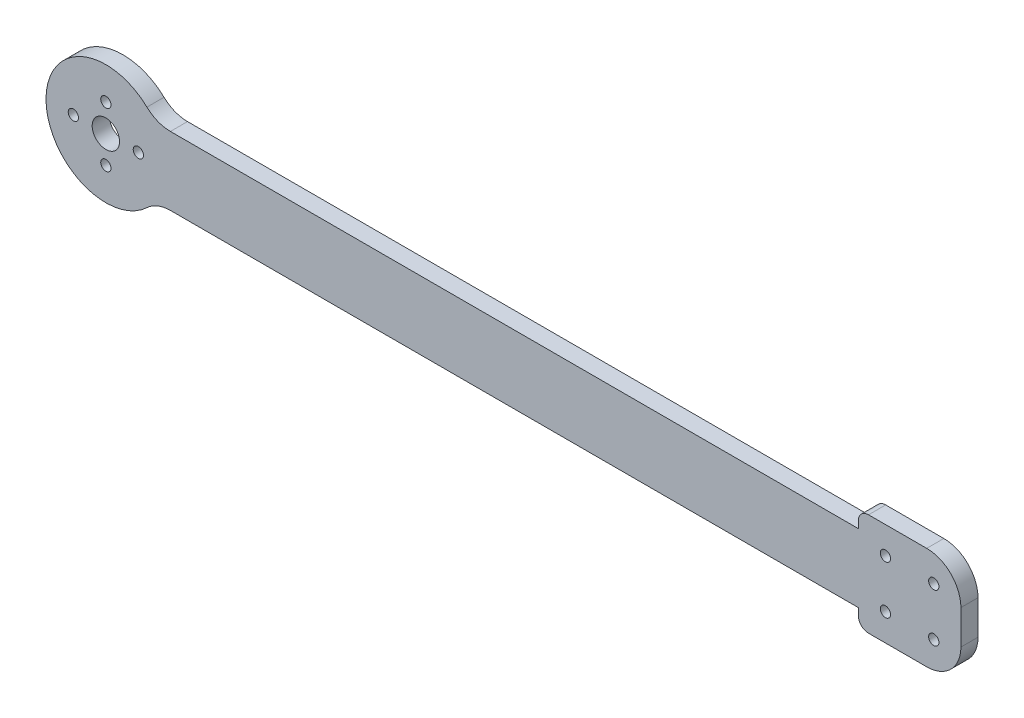
ISO-10303-21;
HEADER;
FILE_DESCRIPTION(('STEP AP214'),'2;1');
FILE_NAME('part.step','',(''),(''),'','','');
FILE_SCHEMA(('AUTOMOTIVE_DESIGN { 1 0 10303 214 1 1 1 1 }'));
ENDSEC;
DATA;
#1=APPLICATION_CONTEXT('core data for automotive mechanical design processes');
#2=APPLICATION_PROTOCOL_DEFINITION('international standard','automotive_design',2000,#1);
#3=PRODUCT_CONTEXT('',#1,'mechanical');
#4=PRODUCT('Part','Part','',(#3));
#5=PRODUCT_RELATED_PRODUCT_CATEGORY('part','',(#4));
#6=PRODUCT_DEFINITION_FORMATION('','',#4);
#7=PRODUCT_DEFINITION_CONTEXT('part definition',#1,'design');
#8=PRODUCT_DEFINITION('design','',#6,#7);
#9=PRODUCT_DEFINITION_SHAPE('','',#8);
#10=(LENGTH_UNIT() NAMED_UNIT(*) SI_UNIT(.MILLI.,.METRE.));
#11=(NAMED_UNIT(*) PLANE_ANGLE_UNIT() SI_UNIT($,.RADIAN.));
#12=(NAMED_UNIT(*) SI_UNIT($,.STERADIAN.) SOLID_ANGLE_UNIT());
#13=UNCERTAINTY_MEASURE_WITH_UNIT(LENGTH_MEASURE(1.E-05),#10,'distance_accuracy_value','');
#14=(GEOMETRIC_REPRESENTATION_CONTEXT(3) GLOBAL_UNCERTAINTY_ASSIGNED_CONTEXT((#13)) GLOBAL_UNIT_ASSIGNED_CONTEXT((#10,
#11,#12)) REPRESENTATION_CONTEXT('',''));
#15=CARTESIAN_POINT('',(0.,0.,0.));
#16=DIRECTION('',(0.,0.,1.));
#17=DIRECTION('',(1.,0.,0.));
#18=AXIS2_PLACEMENT_3D('',#15,#16,#17);
#19=CARTESIAN_POINT('',(240.,5.,5.));
#20=DIRECTION('',(0.,0.,-1.));
#21=DIRECTION('',(-1.,0.,0.));
#22=AXIS2_PLACEMENT_3D('',#19,#20,#21);
#23=PLANE('',#22);
#24=CARTESIAN_POINT('',(240.,5.,5.));
#25=DIRECTION('',(0.,0.,1.));
#26=DIRECTION('',(-1.,0.,0.));
#27=AXIS2_PLACEMENT_3D('',#24,#25,#26);
#28=CIRCLE('',#27,10.);
#29=CARTESIAN_POINT('',(250.,4.99999999999993,5.));
#30=VERTEX_POINT('',#29);
#31=CARTESIAN_POINT('',(240.,15.,5.));
#32=VERTEX_POINT('',#31);
#33=EDGE_CURVE('E195',#30,#32,#28,.T.);
#34=ORIENTED_EDGE('',*,*,#33,.T.);
#35=DIRECTION('',(-1.,0.,0.));
#36=VECTOR('',#35,1.);
#37=CARTESIAN_POINT('',(240.,15.,5.));
#38=LINE('',#37,#36);
#39=CARTESIAN_POINT('',(223.,15.,5.));
#40=VERTEX_POINT('',#39);
#41=EDGE_CURVE('E113',#32,#40,#38,.T.);
#42=ORIENTED_EDGE('',*,*,#41,.T.);
#43=CARTESIAN_POINT('',(223.,12.,5.));
#44=DIRECTION('',(0.,0.,1.));
#45=DIRECTION('',(-1.,0.,0.));
#46=AXIS2_PLACEMENT_3D('',#43,#44,#45);
#47=CIRCLE('',#46,3.);
#48=CARTESIAN_POINT('',(220.,12.,5.));
#49=VERTEX_POINT('',#48);
#50=EDGE_CURVE('E228',#40,#49,#47,.T.);
#51=ORIENTED_EDGE('',*,*,#50,.T.);
#52=DIRECTION('',(0.,-1.,0.));
#53=VECTOR('',#52,1.);
#54=CARTESIAN_POINT('',(220.,12.,5.));
#55=LINE('',#54,#53);
#56=CARTESIAN_POINT('',(220.,10.,5.));
#57=VERTEX_POINT('',#56);
#58=EDGE_CURVE('E247',#49,#57,#55,.T.);
#59=ORIENTED_EDGE('',*,*,#58,.T.);
#60=DIRECTION('',(-1.,0.,0.));
#61=VECTOR('',#60,1.);
#62=CARTESIAN_POINT('',(18.8745860881769,10.,5.));
#63=LINE('',#62,#61);
#64=CARTESIAN_POINT('',(18.8745860881769,10.,5.));
#65=VERTEX_POINT('',#64);
#66=EDGE_CURVE('E244',#57,#65,#63,.T.);
#67=ORIENTED_EDGE('',*,*,#66,.T.);
#68=CARTESIAN_POINT('',(18.8745860881769,20.,5.));
#69=DIRECTION('',(0.,0.,-1.));
#70=DIRECTION('',(-1.,0.,0.));
#71=AXIS2_PLACEMENT_3D('',#68,#69,#70);
#72=CIRCLE('',#71,10.);
#73=CARTESIAN_POINT('',(12.0111002379307,12.7272727272727,5.));
#74=VERTEX_POINT('',#73);
#75=EDGE_CURVE('E246',#65,#74,#72,.T.);
#76=ORIENTED_EDGE('',*,*,#75,.T.);
#77=CARTESIAN_POINT('',(0.,0.,5.));
#78=DIRECTION('',(0.,0.,1.));
#79=DIRECTION('',(1.,0.,0.));
#80=AXIS2_PLACEMENT_3D('',#77,#78,#79);
#81=CIRCLE('',#80,17.5);
#82=CARTESIAN_POINT('',(12.0111002379307,-12.7272727272727,5.));
#83=VERTEX_POINT('',#82);
#84=EDGE_CURVE('E249',#74,#83,#81,.T.);
#85=ORIENTED_EDGE('',*,*,#84,.T.);
#86=CARTESIAN_POINT('',(18.8745860881769,-20.,5.));
#87=DIRECTION('',(0.,0.,-1.));
#88=DIRECTION('',(-1.,0.,0.));
#89=AXIS2_PLACEMENT_3D('',#86,#87,#88);
#90=CIRCLE('',#89,10.);
#91=CARTESIAN_POINT('',(18.8745860881769,-10.,5.));
#92=VERTEX_POINT('',#91);
#93=EDGE_CURVE('E255',#83,#92,#90,.T.);
#94=ORIENTED_EDGE('',*,*,#93,.T.);
#95=DIRECTION('',(1.,0.,0.));
#96=VECTOR('',#95,1.);
#97=CARTESIAN_POINT('',(18.8745860881769,-10.,5.));
#98=LINE('',#97,#96);
#99=CARTESIAN_POINT('',(220.,-10.,5.));
#100=VERTEX_POINT('',#99);
#101=EDGE_CURVE('E257',#92,#100,#98,.T.);
#102=ORIENTED_EDGE('',*,*,#101,.T.);
#103=DIRECTION('',(0.,-1.,0.));
#104=VECTOR('',#103,1.);
#105=CARTESIAN_POINT('',(220.,-10.,5.));
#106=LINE('',#105,#104);
#107=CARTESIAN_POINT('',(220.,-12.,5.));
#108=VERTEX_POINT('',#107);
#109=EDGE_CURVE('E259',#100,#108,#106,.T.);
#110=ORIENTED_EDGE('',*,*,#109,.T.);
#111=CARTESIAN_POINT('',(223.,-12.,5.));
#112=DIRECTION('',(0.,0.,1.));
#113=DIRECTION('',(-1.,0.,0.));
#114=AXIS2_PLACEMENT_3D('',#111,#112,#113);
#115=CIRCLE('',#114,3.);
#116=CARTESIAN_POINT('',(223.,-15.,5.));
#117=VERTEX_POINT('',#116);
#118=EDGE_CURVE('E150',#108,#117,#115,.T.);
#119=ORIENTED_EDGE('',*,*,#118,.T.);
#120=DIRECTION('',(1.,0.,0.));
#121=VECTOR('',#120,1.);
#122=CARTESIAN_POINT('',(240.,-15.,5.));
#123=LINE('',#122,#121);
#124=CARTESIAN_POINT('',(240.,-15.,5.));
#125=VERTEX_POINT('',#124);
#126=EDGE_CURVE('E144',#117,#125,#123,.T.);
#127=ORIENTED_EDGE('',*,*,#126,.T.);
#128=CARTESIAN_POINT('',(240.,-5.,5.));
#129=DIRECTION('',(0.,0.,1.));
#130=DIRECTION('',(-1.,0.,0.));
#131=AXIS2_PLACEMENT_3D('',#128,#129,#130);
#132=CIRCLE('',#131,10.);
#133=CARTESIAN_POINT('',(250.,-4.99999999999993,5.));
#134=VERTEX_POINT('',#133);
#135=EDGE_CURVE('E148',#125,#134,#132,.T.);
#136=ORIENTED_EDGE('',*,*,#135,.T.);
#137=DIRECTION('',(0.,1.,0.));
#138=VECTOR('',#137,1.);
#139=CARTESIAN_POINT('',(250.,-4.99999999999993,5.));
#140=LINE('',#139,#138);
#141=EDGE_CURVE('E52',#134,#30,#140,.T.);
#142=ORIENTED_EDGE('',*,*,#141,.T.);
#143=EDGE_LOOP('',(#34,#42,#51,#59,#67,#76,#85,#94,#102,#110,#119,#127,#136,#142));
#144=FACE_BOUND('',#143,.T.);
#145=CARTESIAN_POINT('',(0.,0.,5.));
#146=DIRECTION('',(0.,0.,1.));
#147=DIRECTION('',(1.,0.,0.));
#148=AXIS2_PLACEMENT_3D('',#145,#146,#147);
#149=CIRCLE('',#148,4.);
#150=CARTESIAN_POINT('',(4.,0.,5.));
#151=VERTEX_POINT('',#150);
#152=EDGE_CURVE('E172',#151,#151,#149,.T.);
#153=ORIENTED_EDGE('',*,*,#152,.F.);
#154=EDGE_LOOP('',(#153));
#155=FACE_BOUND('',#154,.T.);
#156=CARTESIAN_POINT('',(9.5,0.,5.));
#157=DIRECTION('',(0.,0.,1.));
#158=DIRECTION('',(1.,0.,0.));
#159=AXIS2_PLACEMENT_3D('',#156,#157,#158);
#160=CIRCLE('',#159,1.50000000000003);
#161=CARTESIAN_POINT('',(11.,0.,5.));
#162=VERTEX_POINT('',#161);
#163=EDGE_CURVE('E373',#162,#162,#160,.T.);
#164=ORIENTED_EDGE('',*,*,#163,.F.);
#165=EDGE_LOOP('',(#164));
#166=FACE_BOUND('',#165,.T.);
#167=CARTESIAN_POINT('',(0.,8.,5.));
#168=DIRECTION('',(0.,0.,1.));
#169=DIRECTION('',(1.,0.,0.));
#170=AXIS2_PLACEMENT_3D('',#167,#168,#169);
#171=CIRCLE('',#170,1.5);
#172=CARTESIAN_POINT('',(1.5,8.,5.));
#173=VERTEX_POINT('',#172);
#174=EDGE_CURVE('E367',#173,#173,#171,.T.);
#175=ORIENTED_EDGE('',*,*,#174,.F.);
#176=EDGE_LOOP('',(#175));
#177=FACE_BOUND('',#176,.T.);
#178=CARTESIAN_POINT('',(-9.5,0.,5.));
#179=DIRECTION('',(0.,0.,1.));
#180=DIRECTION('',(1.,0.,0.));
#181=AXIS2_PLACEMENT_3D('',#178,#179,#180);
#182=CIRCLE('',#181,1.50000000000009);
#183=CARTESIAN_POINT('',(-7.99999999999991,0.,5.));
#184=VERTEX_POINT('',#183);
#185=EDGE_CURVE('E361',#184,#184,#182,.T.);
#186=ORIENTED_EDGE('',*,*,#185,.F.);
#187=EDGE_LOOP('',(#186));
#188=FACE_BOUND('',#187,.T.);
#189=CARTESIAN_POINT('',(0.,-8.,5.));
#190=DIRECTION('',(0.,0.,1.));
#191=DIRECTION('',(1.,0.,0.));
#192=AXIS2_PLACEMENT_3D('',#189,#190,#191);
#193=CIRCLE('',#192,1.5);
#194=CARTESIAN_POINT('',(1.5,-8.,5.));
#195=VERTEX_POINT('',#194);
#196=EDGE_CURVE('E355',#195,#195,#193,.T.);
#197=ORIENTED_EDGE('',*,*,#196,.F.);
#198=EDGE_LOOP('',(#197));
#199=FACE_BOUND('',#198,.T.);
#200=CARTESIAN_POINT('',(227.928932188134,7.07106781186549,5.));
#201=DIRECTION('',(0.,0.,1.));
#202=DIRECTION('',(1.,0.,0.));
#203=AXIS2_PLACEMENT_3D('',#200,#201,#202);
#204=CIRCLE('',#203,1.5);
#205=CARTESIAN_POINT('',(229.428932188134,7.07106781186549,5.));
#206=VERTEX_POINT('',#205);
#207=EDGE_CURVE('E349',#206,#206,#204,.T.);
#208=ORIENTED_EDGE('',*,*,#207,.F.);
#209=EDGE_LOOP('',(#208));
#210=FACE_BOUND('',#209,.T.);
#211=CARTESIAN_POINT('',(242.071067811866,-7.07106781186549,5.));
#212=DIRECTION('',(0.,0.,1.));
#213=DIRECTION('',(-1.,0.,0.));
#214=AXIS2_PLACEMENT_3D('',#211,#212,#213);
#215=CIRCLE('',#214,1.49999999999999);
#216=CARTESIAN_POINT('',(240.571067811866,-7.07106781186549,5.));
#217=VERTEX_POINT('',#216);
#218=EDGE_CURVE('E343',#217,#217,#215,.T.);
#219=ORIENTED_EDGE('',*,*,#218,.F.);
#220=EDGE_LOOP('',(#219));
#221=FACE_BOUND('',#220,.T.);
#222=CARTESIAN_POINT('',(242.071067811866,7.07106781186549,5.));
#223=DIRECTION('',(0.,0.,1.));
#224=DIRECTION('',(1.,0.,0.));
#225=AXIS2_PLACEMENT_3D('',#222,#223,#224);
#226=CIRCLE('',#225,1.49999999999999);
#227=CARTESIAN_POINT('',(243.571067811866,7.07106781186549,5.));
#228=VERTEX_POINT('',#227);
#229=EDGE_CURVE('E337',#228,#228,#226,.T.);
#230=ORIENTED_EDGE('',*,*,#229,.F.);
#231=EDGE_LOOP('',(#230));
#232=FACE_BOUND('',#231,.T.);
#233=CARTESIAN_POINT('',(227.928932188134,-7.07106781186549,5.));
#234=DIRECTION('',(0.,0.,1.));
#235=DIRECTION('',(-1.,0.,0.));
#236=AXIS2_PLACEMENT_3D('',#233,#234,#235);
#237=CIRCLE('',#236,1.5);
#238=CARTESIAN_POINT('',(226.428932188134,-7.07106781186549,5.));
#239=VERTEX_POINT('',#238);
#240=EDGE_CURVE('E328',#239,#239,#237,.T.);
#241=ORIENTED_EDGE('',*,*,#240,.F.);
#242=EDGE_LOOP('',(#241));
#243=FACE_BOUND('',#242,.T.);
#244=ADVANCED_FACE('F35',(#144,#155,#166,#177,#188,#199,#210,#221,#232,#243),#23,.F.);
#245=CARTESIAN_POINT('',(240.,5.,0.));
#246=DIRECTION('',(0.,0.,-1.));
#247=DIRECTION('',(-1.,0.,0.));
#248=AXIS2_PLACEMENT_3D('',#245,#246,#247);
#249=PLANE('',#248);
#250=CARTESIAN_POINT('',(242.071067811866,7.07106781186549,0.));
#251=DIRECTION('',(0.,0.,1.));
#252=DIRECTION('',(1.,0.,0.));
#253=AXIS2_PLACEMENT_3D('',#250,#251,#252);
#254=CIRCLE('',#253,1.49999999999999);
#255=CARTESIAN_POINT('',(243.571067811866,7.07106781186549,0.));
#256=VERTEX_POINT('',#255);
#257=EDGE_CURVE('E334',#256,#256,#254,.T.);
#258=ORIENTED_EDGE('',*,*,#257,.T.);
#259=EDGE_LOOP('',(#258));
#260=FACE_BOUND('',#259,.T.);
#261=CARTESIAN_POINT('',(227.928932188134,7.07106781186549,0.));
#262=DIRECTION('',(0.,0.,1.));
#263=DIRECTION('',(1.,0.,0.));
#264=AXIS2_PLACEMENT_3D('',#261,#262,#263);
#265=CIRCLE('',#264,1.5);
#266=CARTESIAN_POINT('',(229.428932188134,7.07106781186549,0.));
#267=VERTEX_POINT('',#266);
#268=EDGE_CURVE('E346',#267,#267,#265,.T.);
#269=ORIENTED_EDGE('',*,*,#268,.T.);
#270=EDGE_LOOP('',(#269));
#271=FACE_BOUND('',#270,.T.);
#272=CARTESIAN_POINT('',(-9.5,0.,0.));
#273=DIRECTION('',(0.,0.,1.));
#274=DIRECTION('',(1.,0.,0.));
#275=AXIS2_PLACEMENT_3D('',#272,#273,#274);
#276=CIRCLE('',#275,1.50000000000009);
#277=CARTESIAN_POINT('',(-7.99999999999991,0.,0.));
#278=VERTEX_POINT('',#277);
#279=EDGE_CURVE('E358',#278,#278,#276,.T.);
#280=ORIENTED_EDGE('',*,*,#279,.T.);
#281=EDGE_LOOP('',(#280));
#282=FACE_BOUND('',#281,.T.);
#283=CARTESIAN_POINT('',(9.5,0.,0.));
#284=DIRECTION('',(0.,0.,1.));
#285=DIRECTION('',(1.,0.,0.));
#286=AXIS2_PLACEMENT_3D('',#283,#284,#285);
#287=CIRCLE('',#286,1.50000000000003);
#288=CARTESIAN_POINT('',(11.,0.,0.));
#289=VERTEX_POINT('',#288);
#290=EDGE_CURVE('E370',#289,#289,#287,.T.);
#291=ORIENTED_EDGE('',*,*,#290,.T.);
#292=EDGE_LOOP('',(#291));
#293=FACE_BOUND('',#292,.T.);
#294=CARTESIAN_POINT('',(240.,5.,0.));
#295=DIRECTION('',(0.,0.,1.));
#296=DIRECTION('',(-1.,0.,0.));
#297=AXIS2_PLACEMENT_3D('',#294,#295,#296);
#298=CIRCLE('',#297,10.);
#299=CARTESIAN_POINT('',(250.,4.99999999999993,0.));
#300=VERTEX_POINT('',#299);
#301=CARTESIAN_POINT('',(240.,15.,0.));
#302=VERTEX_POINT('',#301);
#303=EDGE_CURVE('E168',#300,#302,#298,.T.);
#304=ORIENTED_EDGE('',*,*,#303,.F.);
#305=DIRECTION('',(0.,1.,0.));
#306=VECTOR('',#305,1.);
#307=CARTESIAN_POINT('',(250.,-4.99999999999993,0.));
#308=LINE('',#307,#306);
#309=CARTESIAN_POINT('',(250.,-4.99999999999993,0.));
#310=VERTEX_POINT('',#309);
#311=EDGE_CURVE('E105',#310,#300,#308,.T.);
#312=ORIENTED_EDGE('',*,*,#311,.F.);
#313=CARTESIAN_POINT('',(240.,-5.,0.));
#314=DIRECTION('',(0.,0.,1.));
#315=DIRECTION('',(-1.,0.,0.));
#316=AXIS2_PLACEMENT_3D('',#313,#314,#315);
#317=CIRCLE('',#316,10.);
#318=CARTESIAN_POINT('',(240.,-15.,0.));
#319=VERTEX_POINT('',#318);
#320=EDGE_CURVE('E99',#319,#310,#317,.T.);
#321=ORIENTED_EDGE('',*,*,#320,.F.);
#322=DIRECTION('',(1.,0.,0.));
#323=VECTOR('',#322,1.);
#324=CARTESIAN_POINT('',(240.,-15.,0.));
#325=LINE('',#324,#323);
#326=CARTESIAN_POINT('',(223.,-15.,0.));
#327=VERTEX_POINT('',#326);
#328=EDGE_CURVE('E158',#327,#319,#325,.T.);
#329=ORIENTED_EDGE('',*,*,#328,.F.);
#330=CARTESIAN_POINT('',(223.,-12.,0.));
#331=DIRECTION('',(0.,0.,1.));
#332=DIRECTION('',(-1.,0.,0.));
#333=AXIS2_PLACEMENT_3D('',#330,#331,#332);
#334=CIRCLE('',#333,3.);
#335=CARTESIAN_POINT('',(220.,-12.,0.));
#336=VERTEX_POINT('',#335);
#337=EDGE_CURVE('E190',#336,#327,#334,.T.);
#338=ORIENTED_EDGE('',*,*,#337,.F.);
#339=DIRECTION('',(0.,-1.,0.));
#340=VECTOR('',#339,1.);
#341=CARTESIAN_POINT('',(220.,-10.,0.));
#342=LINE('',#341,#340);
#343=CARTESIAN_POINT('',(220.,-10.,0.));
#344=VERTEX_POINT('',#343);
#345=EDGE_CURVE('E188',#344,#336,#342,.T.);
#346=ORIENTED_EDGE('',*,*,#345,.F.);
#347=DIRECTION('',(1.,0.,0.));
#348=VECTOR('',#347,1.);
#349=CARTESIAN_POINT('',(18.8745860881769,-10.,0.));
#350=LINE('',#349,#348);
#351=CARTESIAN_POINT('',(18.8745860881769,-10.,0.));
#352=VERTEX_POINT('',#351);
#353=EDGE_CURVE('E186',#352,#344,#350,.T.);
#354=ORIENTED_EDGE('',*,*,#353,.F.);
#355=CARTESIAN_POINT('',(18.8745860881769,-20.,0.));
#356=DIRECTION('',(0.,0.,-1.));
#357=DIRECTION('',(-1.,0.,0.));
#358=AXIS2_PLACEMENT_3D('',#355,#356,#357);
#359=CIRCLE('',#358,10.);
#360=CARTESIAN_POINT('',(12.0111002379307,-12.7272727272727,0.));
#361=VERTEX_POINT('',#360);
#362=EDGE_CURVE('E184',#361,#352,#359,.T.);
#363=ORIENTED_EDGE('',*,*,#362,.F.);
#364=CARTESIAN_POINT('',(0.,0.,0.));
#365=DIRECTION('',(0.,0.,1.));
#366=DIRECTION('',(1.,0.,0.));
#367=AXIS2_PLACEMENT_3D('',#364,#365,#366);
#368=CIRCLE('',#367,17.5);
#369=CARTESIAN_POINT('',(12.0111002379307,12.7272727272727,0.));
#370=VERTEX_POINT('',#369);
#371=EDGE_CURVE('E182',#370,#361,#368,.T.);
#372=ORIENTED_EDGE('',*,*,#371,.F.);
#373=CARTESIAN_POINT('',(18.8745860881769,20.,0.));
#374=DIRECTION('',(0.,0.,-1.));
#375=DIRECTION('',(-1.,0.,0.));
#376=AXIS2_PLACEMENT_3D('',#373,#374,#375);
#377=CIRCLE('',#376,10.);
#378=CARTESIAN_POINT('',(18.8745860881769,10.,0.));
#379=VERTEX_POINT('',#378);
#380=EDGE_CURVE('E180',#379,#370,#377,.T.);
#381=ORIENTED_EDGE('',*,*,#380,.F.);
#382=DIRECTION('',(-1.,0.,0.));
#383=VECTOR('',#382,1.);
#384=CARTESIAN_POINT('',(18.8745860881769,10.,0.));
#385=LINE('',#384,#383);
#386=CARTESIAN_POINT('',(220.,10.,0.));
#387=VERTEX_POINT('',#386);
#388=EDGE_CURVE('E178',#387,#379,#385,.T.);
#389=ORIENTED_EDGE('',*,*,#388,.F.);
#390=DIRECTION('',(0.,-1.,0.));
#391=VECTOR('',#390,1.);
#392=CARTESIAN_POINT('',(220.,12.,0.));
#393=LINE('',#392,#391);
#394=CARTESIAN_POINT('',(220.,12.,0.));
#395=VERTEX_POINT('',#394);
#396=EDGE_CURVE('E176',#395,#387,#393,.T.);
#397=ORIENTED_EDGE('',*,*,#396,.F.);
#398=CARTESIAN_POINT('',(223.,12.,0.));
#399=DIRECTION('',(0.,0.,1.));
#400=DIRECTION('',(-1.,0.,0.));
#401=AXIS2_PLACEMENT_3D('',#398,#399,#400);
#402=CIRCLE('',#401,3.);
#403=CARTESIAN_POINT('',(223.,15.,0.));
#404=VERTEX_POINT('',#403);
#405=EDGE_CURVE('E174',#404,#395,#402,.T.);
#406=ORIENTED_EDGE('',*,*,#405,.F.);
#407=DIRECTION('',(-1.,0.,0.));
#408=VECTOR('',#407,1.);
#409=CARTESIAN_POINT('',(240.,15.,0.));
#410=LINE('',#409,#408);
#411=EDGE_CURVE('E171',#302,#404,#410,.T.);
#412=ORIENTED_EDGE('',*,*,#411,.F.);
#413=EDGE_LOOP('',(#304,#312,#321,#329,#338,#346,#354,#363,#372,#381,#389,#397,#406,#412));
#414=FACE_BOUND('',#413,.T.);
#415=CARTESIAN_POINT('',(0.,0.,0.));
#416=DIRECTION('',(0.,0.,1.));
#417=DIRECTION('',(1.,0.,0.));
#418=AXIS2_PLACEMENT_3D('',#415,#416,#417);
#419=CIRCLE('',#418,4.);
#420=CARTESIAN_POINT('',(4.,0.,0.));
#421=VERTEX_POINT('',#420);
#422=EDGE_CURVE('E376',#421,#421,#419,.T.);
#423=ORIENTED_EDGE('',*,*,#422,.T.);
#424=EDGE_LOOP('',(#423));
#425=FACE_BOUND('',#424,.T.);
#426=CARTESIAN_POINT('',(0.,8.,0.));
#427=DIRECTION('',(0.,0.,1.));
#428=DIRECTION('',(1.,0.,0.));
#429=AXIS2_PLACEMENT_3D('',#426,#427,#428);
#430=CIRCLE('',#429,1.5);
#431=CARTESIAN_POINT('',(1.5,8.,0.));
#432=VERTEX_POINT('',#431);
#433=EDGE_CURVE('E364',#432,#432,#430,.T.);
#434=ORIENTED_EDGE('',*,*,#433,.T.);
#435=EDGE_LOOP('',(#434));
#436=FACE_BOUND('',#435,.T.);
#437=CARTESIAN_POINT('',(0.,-8.,0.));
#438=DIRECTION('',(0.,0.,1.));
#439=DIRECTION('',(1.,0.,0.));
#440=AXIS2_PLACEMENT_3D('',#437,#438,#439);
#441=CIRCLE('',#440,1.5);
#442=CARTESIAN_POINT('',(1.5,-8.,0.));
#443=VERTEX_POINT('',#442);
#444=EDGE_CURVE('E352',#443,#443,#441,.T.);
#445=ORIENTED_EDGE('',*,*,#444,.T.);
#446=EDGE_LOOP('',(#445));
#447=FACE_BOUND('',#446,.T.);
#448=CARTESIAN_POINT('',(242.071067811866,-7.07106781186549,0.));
#449=DIRECTION('',(0.,0.,1.));
#450=DIRECTION('',(-1.,0.,0.));
#451=AXIS2_PLACEMENT_3D('',#448,#449,#450);
#452=CIRCLE('',#451,1.49999999999999);
#453=CARTESIAN_POINT('',(240.571067811866,-7.07106781186549,0.));
#454=VERTEX_POINT('',#453);
#455=EDGE_CURVE('E340',#454,#454,#452,.T.);
#456=ORIENTED_EDGE('',*,*,#455,.T.);
#457=EDGE_LOOP('',(#456));
#458=FACE_BOUND('',#457,.T.);
#459=CARTESIAN_POINT('',(227.928932188134,-7.07106781186549,0.));
#460=DIRECTION('',(0.,0.,1.));
#461=DIRECTION('',(-1.,0.,0.));
#462=AXIS2_PLACEMENT_3D('',#459,#460,#461);
#463=CIRCLE('',#462,1.5);
#464=CARTESIAN_POINT('',(226.428932188134,-7.07106781186549,0.));
#465=VERTEX_POINT('',#464);
#466=EDGE_CURVE('E331',#465,#465,#463,.T.);
#467=ORIENTED_EDGE('',*,*,#466,.T.);
#468=EDGE_LOOP('',(#467));
#469=FACE_BOUND('',#468,.T.);
#470=ADVANCED_FACE('F232',(#260,#271,#282,#293,#414,#425,#436,#447,#458,#469),#249,.T.);
#471=CARTESIAN_POINT('',(240.,5.,5.));
#472=DIRECTION('',(0.,0.,-1.));
#473=DIRECTION('',(-1.,0.,0.));
#474=AXIS2_PLACEMENT_3D('',#471,#472,#473);
#475=CYLINDRICAL_SURFACE('',#474,10.);
#476=ORIENTED_EDGE('',*,*,#303,.T.);
#477=DIRECTION('',(0.,0.,-1.));
#478=VECTOR('',#477,1.);
#479=CARTESIAN_POINT('',(240.,15.,5.));
#480=LINE('',#479,#478);
#481=EDGE_CURVE('E11',#32,#302,#480,.T.);
#482=ORIENTED_EDGE('',*,*,#481,.F.);
#483=ORIENTED_EDGE('',*,*,#33,.F.);
#484=DIRECTION('',(0.,0.,-1.));
#485=VECTOR('',#484,1.);
#486=CARTESIAN_POINT('',(250.,4.99999999999993,5.));
#487=LINE('',#486,#485);
#488=EDGE_CURVE('E164',#30,#300,#487,.T.);
#489=ORIENTED_EDGE('',*,*,#488,.T.);
#490=EDGE_LOOP('',(#476,#482,#483,#489));
#491=FACE_BOUND('',#490,.T.);
#492=ADVANCED_FACE('F37',(#491),#475,.T.);
#493=CARTESIAN_POINT('',(240.,15.,5.));
#494=DIRECTION('',(0.,-1.,0.));
#495=DIRECTION('',(1.,0.,0.));
#496=AXIS2_PLACEMENT_3D('',#493,#494,#495);
#497=PLANE('',#496);
#498=ORIENTED_EDGE('',*,*,#411,.T.);
#499=DIRECTION('',(0.,0.,-1.));
#500=VECTOR('',#499,1.);
#501=CARTESIAN_POINT('',(223.,15.,5.));
#502=LINE('',#501,#500);
#503=EDGE_CURVE('E44',#40,#404,#502,.T.);
#504=ORIENTED_EDGE('',*,*,#503,.F.);
#505=ORIENTED_EDGE('',*,*,#41,.F.);
#506=ORIENTED_EDGE('',*,*,#481,.T.);
#507=EDGE_LOOP('',(#498,#504,#505,#506));
#508=FACE_BOUND('',#507,.T.);
#509=ADVANCED_FACE('F553',(#508),#497,.F.);
#510=CARTESIAN_POINT('',(223.,12.,5.));
#511=DIRECTION('',(0.,0.,-1.));
#512=DIRECTION('',(-1.,0.,0.));
#513=AXIS2_PLACEMENT_3D('',#510,#511,#512);
#514=CYLINDRICAL_SURFACE('',#513,3.);
#515=ORIENTED_EDGE('',*,*,#405,.T.);
#516=DIRECTION('',(0.,0.,-1.));
#517=VECTOR('',#516,1.);
#518=CARTESIAN_POINT('',(220.,12.,5.));
#519=LINE('',#518,#517);
#520=EDGE_CURVE('E220',#49,#395,#519,.T.);
#521=ORIENTED_EDGE('',*,*,#520,.F.);
#522=ORIENTED_EDGE('',*,*,#50,.F.);
#523=ORIENTED_EDGE('',*,*,#503,.T.);
#524=EDGE_LOOP('',(#515,#521,#522,#523));
#525=FACE_BOUND('',#524,.T.);
#526=ADVANCED_FACE('F226',(#525),#514,.T.);
#527=CARTESIAN_POINT('',(220.,12.,5.));
#528=DIRECTION('',(1.,0.,0.));
#529=DIRECTION('',(0.,0.,-1.));
#530=AXIS2_PLACEMENT_3D('',#527,#528,#529);
#531=PLANE('',#530);
#532=ORIENTED_EDGE('',*,*,#396,.T.);
#533=DIRECTION('',(0.,0.,-1.));
#534=VECTOR('',#533,1.);
#535=CARTESIAN_POINT('',(220.,10.,5.));
#536=LINE('',#535,#534);
#537=EDGE_CURVE('E217',#57,#387,#536,.T.);
#538=ORIENTED_EDGE('',*,*,#537,.F.);
#539=ORIENTED_EDGE('',*,*,#58,.F.);
#540=ORIENTED_EDGE('',*,*,#520,.T.);
#541=EDGE_LOOP('',(#532,#538,#539,#540));
#542=FACE_BOUND('',#541,.T.);
#543=ADVANCED_FACE('F238',(#542),#531,.F.);
#544=CARTESIAN_POINT('',(18.8745860881769,10.,5.));
#545=DIRECTION('',(0.,-1.,0.));
#546=DIRECTION('',(0.,0.,-1.));
#547=AXIS2_PLACEMENT_3D('',#544,#545,#546);
#548=PLANE('',#547);
#549=ORIENTED_EDGE('',*,*,#388,.T.);
#550=DIRECTION('',(0.,0.,-1.));
#551=VECTOR('',#550,1.);
#552=CARTESIAN_POINT('',(18.8745860881769,10.,5.));
#553=LINE('',#552,#551);
#554=EDGE_CURVE('E214',#65,#379,#553,.T.);
#555=ORIENTED_EDGE('',*,*,#554,.F.);
#556=ORIENTED_EDGE('',*,*,#66,.F.);
#557=ORIENTED_EDGE('',*,*,#537,.T.);
#558=EDGE_LOOP('',(#549,#555,#556,#557));
#559=FACE_BOUND('',#558,.T.);
#560=ADVANCED_FACE('F242',(#559),#548,.F.);
#561=CARTESIAN_POINT('',(18.8745860881769,20.,5.));
#562=DIRECTION('',(0.,0.,-1.));
#563=DIRECTION('',(-1.,0.,0.));
#564=AXIS2_PLACEMENT_3D('',#561,#562,#563);
#565=CYLINDRICAL_SURFACE('',#564,10.);
#566=ORIENTED_EDGE('',*,*,#380,.T.);
#567=DIRECTION('',(0.,0.,-1.));
#568=VECTOR('',#567,1.);
#569=CARTESIAN_POINT('',(12.0111002379307,12.7272727272727,5.));
#570=LINE('',#569,#568);
#571=EDGE_CURVE('E211',#74,#370,#570,.T.);
#572=ORIENTED_EDGE('',*,*,#571,.F.);
#573=ORIENTED_EDGE('',*,*,#75,.F.);
#574=ORIENTED_EDGE('',*,*,#554,.T.);
#575=EDGE_LOOP('',(#566,#572,#573,#574));
#576=FACE_BOUND('',#575,.T.);
#577=ADVANCED_FACE('F518',(#576),#565,.F.);
#578=CARTESIAN_POINT('',(0.,0.,5.));
#579=DIRECTION('',(0.,0.,-1.));
#580=DIRECTION('',(-1.,0.,0.));
#581=AXIS2_PLACEMENT_3D('',#578,#579,#580);
#582=CYLINDRICAL_SURFACE('',#581,17.5);
#583=ORIENTED_EDGE('',*,*,#371,.T.);
#584=DIRECTION('',(0.,0.,-1.));
#585=VECTOR('',#584,1.);
#586=CARTESIAN_POINT('',(12.0111002379307,-12.7272727272727,5.));
#587=LINE('',#586,#585);
#588=EDGE_CURVE('E208',#83,#361,#587,.T.);
#589=ORIENTED_EDGE('',*,*,#588,.F.);
#590=ORIENTED_EDGE('',*,*,#84,.F.);
#591=ORIENTED_EDGE('',*,*,#571,.T.);
#592=EDGE_LOOP('',(#583,#589,#590,#591));
#593=FACE_BOUND('',#592,.T.);
#594=ADVANCED_FACE('F508',(#593),#582,.T.);
#595=CARTESIAN_POINT('',(18.8745860881769,-20.,5.));
#596=DIRECTION('',(0.,0.,-1.));
#597=DIRECTION('',(-1.,0.,0.));
#598=AXIS2_PLACEMENT_3D('',#595,#596,#597);
#599=CYLINDRICAL_SURFACE('',#598,10.);
#600=ORIENTED_EDGE('',*,*,#362,.T.);
#601=DIRECTION('',(0.,0.,-1.));
#602=VECTOR('',#601,1.);
#603=CARTESIAN_POINT('',(18.8745860881769,-10.,5.));
#604=LINE('',#603,#602);
#605=EDGE_CURVE('E205',#92,#352,#604,.T.);
#606=ORIENTED_EDGE('',*,*,#605,.F.);
#607=ORIENTED_EDGE('',*,*,#93,.F.);
#608=ORIENTED_EDGE('',*,*,#588,.T.);
#609=EDGE_LOOP('',(#600,#606,#607,#608));
#610=FACE_BOUND('',#609,.T.);
#611=ADVANCED_FACE('F498',(#610),#599,.F.);
#612=CARTESIAN_POINT('',(18.8745860881769,-10.,5.));
#613=DIRECTION('',(0.,1.,0.));
#614=DIRECTION('',(-1.,0.,0.));
#615=AXIS2_PLACEMENT_3D('',#612,#613,#614);
#616=PLANE('',#615);
#617=ORIENTED_EDGE('',*,*,#353,.T.);
#618=DIRECTION('',(0.,0.,-1.));
#619=VECTOR('',#618,1.);
#620=CARTESIAN_POINT('',(220.,-10.,5.));
#621=LINE('',#620,#619);
#622=EDGE_CURVE('E202',#100,#344,#621,.T.);
#623=ORIENTED_EDGE('',*,*,#622,.F.);
#624=ORIENTED_EDGE('',*,*,#101,.F.);
#625=ORIENTED_EDGE('',*,*,#605,.T.);
#626=EDGE_LOOP('',(#617,#623,#624,#625));
#627=FACE_BOUND('',#626,.T.);
#628=ADVANCED_FACE('F489',(#627),#616,.F.);
#629=CARTESIAN_POINT('',(220.,-10.,5.));
#630=DIRECTION('',(1.,0.,0.));
#631=DIRECTION('',(0.,0.,-1.));
#632=AXIS2_PLACEMENT_3D('',#629,#630,#631);
#633=PLANE('',#632);
#634=ORIENTED_EDGE('',*,*,#345,.T.);
#635=DIRECTION('',(0.,0.,-1.));
#636=VECTOR('',#635,1.);
#637=CARTESIAN_POINT('',(220.,-12.,5.));
#638=LINE('',#637,#636);
#639=EDGE_CURVE('E199',#108,#336,#638,.T.);
#640=ORIENTED_EDGE('',*,*,#639,.F.);
#641=ORIENTED_EDGE('',*,*,#109,.F.);
#642=ORIENTED_EDGE('',*,*,#622,.T.);
#643=EDGE_LOOP('',(#634,#640,#641,#642));
#644=FACE_BOUND('',#643,.T.);
#645=ADVANCED_FACE('F265',(#644),#633,.F.);
#646=CARTESIAN_POINT('',(223.,-12.,5.));
#647=DIRECTION('',(0.,0.,-1.));
#648=DIRECTION('',(-1.,0.,0.));
#649=AXIS2_PLACEMENT_3D('',#646,#647,#648);
#650=CYLINDRICAL_SURFACE('',#649,3.);
#651=ORIENTED_EDGE('',*,*,#337,.T.);
#652=DIRECTION('',(0.,0.,-1.));
#653=VECTOR('',#652,1.);
#654=CARTESIAN_POINT('',(223.,-15.,5.));
#655=LINE('',#654,#653);
#656=EDGE_CURVE('E159',#117,#327,#655,.T.);
#657=ORIENTED_EDGE('',*,*,#656,.F.);
#658=ORIENTED_EDGE('',*,*,#118,.F.);
#659=ORIENTED_EDGE('',*,*,#639,.T.);
#660=EDGE_LOOP('',(#651,#657,#658,#659));
#661=FACE_BOUND('',#660,.T.);
#662=ADVANCED_FACE('F269',(#661),#650,.T.);
#663=CARTESIAN_POINT('',(240.,-15.,5.));
#664=DIRECTION('',(0.,1.,0.));
#665=DIRECTION('',(-1.,0.,0.));
#666=AXIS2_PLACEMENT_3D('',#663,#664,#665);
#667=PLANE('',#666);
#668=ORIENTED_EDGE('',*,*,#328,.T.);
#669=DIRECTION('',(0.,0.,-1.));
#670=VECTOR('',#669,1.);
#671=CARTESIAN_POINT('',(240.,-15.,5.));
#672=LINE('',#671,#670);
#673=EDGE_CURVE('E155',#125,#319,#672,.T.);
#674=ORIENTED_EDGE('',*,*,#673,.F.);
#675=ORIENTED_EDGE('',*,*,#126,.F.);
#676=ORIENTED_EDGE('',*,*,#656,.T.);
#677=EDGE_LOOP('',(#668,#674,#675,#676));
#678=FACE_BOUND('',#677,.T.);
#679=ADVANCED_FACE('F156',(#678),#667,.F.);
#680=CARTESIAN_POINT('',(240.,-5.,5.));
#681=DIRECTION('',(0.,0.,-1.));
#682=DIRECTION('',(-1.,0.,0.));
#683=AXIS2_PLACEMENT_3D('',#680,#681,#682);
#684=CYLINDRICAL_SURFACE('',#683,10.);
#685=ORIENTED_EDGE('',*,*,#320,.T.);
#686=DIRECTION('',(0.,0.,-1.));
#687=VECTOR('',#686,1.);
#688=CARTESIAN_POINT('',(250.,-4.99999999999993,5.));
#689=LINE('',#688,#687);
#690=EDGE_CURVE('E160',#134,#310,#689,.T.);
#691=ORIENTED_EDGE('',*,*,#690,.F.);
#692=ORIENTED_EDGE('',*,*,#135,.F.);
#693=ORIENTED_EDGE('',*,*,#673,.T.);
#694=EDGE_LOOP('',(#685,#691,#692,#693));
#695=FACE_BOUND('',#694,.T.);
#696=ADVANCED_FACE('F162',(#695),#684,.T.);
#697=CARTESIAN_POINT('',(250.,-4.99999999999993,5.));
#698=DIRECTION('',(-1.,0.,0.));
#699=DIRECTION('',(0.,0.,1.));
#700=AXIS2_PLACEMENT_3D('',#697,#698,#699);
#701=PLANE('',#700);
#702=ORIENTED_EDGE('',*,*,#311,.T.);
#703=ORIENTED_EDGE('',*,*,#488,.F.);
#704=ORIENTED_EDGE('',*,*,#141,.F.);
#705=ORIENTED_EDGE('',*,*,#690,.T.);
#706=EDGE_LOOP('',(#702,#703,#704,#705));
#707=FACE_BOUND('',#706,.T.);
#708=ADVANCED_FACE('F273',(#707),#701,.F.);
#709=CARTESIAN_POINT('',(0.,0.,5.));
#710=DIRECTION('',(0.,0.,-1.));
#711=DIRECTION('',(-1.,0.,0.));
#712=AXIS2_PLACEMENT_3D('',#709,#710,#711);
#713=CYLINDRICAL_SURFACE('',#712,4.);
#714=ORIENTED_EDGE('',*,*,#152,.T.);
#715=EDGE_LOOP('',(#714));
#716=FACE_BOUND('',#715,.T.);
#717=ORIENTED_EDGE('',*,*,#422,.F.);
#718=EDGE_LOOP('',(#717));
#719=FACE_BOUND('',#718,.T.);
#720=ADVANCED_FACE('F275',(#716,#719),#713,.F.);
#721=CARTESIAN_POINT('',(9.5,0.,5.));
#722=DIRECTION('',(0.,0.,-1.));
#723=DIRECTION('',(-1.,0.,0.));
#724=AXIS2_PLACEMENT_3D('',#721,#722,#723);
#725=CYLINDRICAL_SURFACE('',#724,1.50000000000003);
#726=ORIENTED_EDGE('',*,*,#163,.T.);
#727=EDGE_LOOP('',(#726));
#728=FACE_BOUND('',#727,.T.);
#729=ORIENTED_EDGE('',*,*,#290,.F.);
#730=EDGE_LOOP('',(#729));
#731=FACE_BOUND('',#730,.T.);
#732=ADVANCED_FACE('F281',(#728,#731),#725,.F.);
#733=CARTESIAN_POINT('',(0.,8.,5.));
#734=DIRECTION('',(0.,0.,-1.));
#735=DIRECTION('',(-1.,0.,0.));
#736=AXIS2_PLACEMENT_3D('',#733,#734,#735);
#737=CYLINDRICAL_SURFACE('',#736,1.5);
#738=ORIENTED_EDGE('',*,*,#174,.T.);
#739=EDGE_LOOP('',(#738));
#740=FACE_BOUND('',#739,.T.);
#741=ORIENTED_EDGE('',*,*,#433,.F.);
#742=EDGE_LOOP('',(#741));
#743=FACE_BOUND('',#742,.T.);
#744=ADVANCED_FACE('F295',(#740,#743),#737,.F.);
#745=CARTESIAN_POINT('',(-9.5,0.,5.));
#746=DIRECTION('',(0.,0.,-1.));
#747=DIRECTION('',(-1.,0.,0.));
#748=AXIS2_PLACEMENT_3D('',#745,#746,#747);
#749=CYLINDRICAL_SURFACE('',#748,1.50000000000009);
#750=ORIENTED_EDGE('',*,*,#185,.T.);
#751=EDGE_LOOP('',(#750));
#752=FACE_BOUND('',#751,.T.);
#753=ORIENTED_EDGE('',*,*,#279,.F.);
#754=EDGE_LOOP('',(#753));
#755=FACE_BOUND('',#754,.T.);
#756=ADVANCED_FACE('F299',(#752,#755),#749,.F.);
#757=CARTESIAN_POINT('',(0.,-8.,5.));
#758=DIRECTION('',(0.,0.,-1.));
#759=DIRECTION('',(-1.,0.,0.));
#760=AXIS2_PLACEMENT_3D('',#757,#758,#759);
#761=CYLINDRICAL_SURFACE('',#760,1.5);
#762=ORIENTED_EDGE('',*,*,#196,.T.);
#763=EDGE_LOOP('',(#762));
#764=FACE_BOUND('',#763,.T.);
#765=ORIENTED_EDGE('',*,*,#444,.F.);
#766=EDGE_LOOP('',(#765));
#767=FACE_BOUND('',#766,.T.);
#768=ADVANCED_FACE('F303',(#764,#767),#761,.F.);
#769=CARTESIAN_POINT('',(227.928932188134,7.07106781186549,5.));
#770=DIRECTION('',(0.,0.,-1.));
#771=DIRECTION('',(-1.,0.,0.));
#772=AXIS2_PLACEMENT_3D('',#769,#770,#771);
#773=CYLINDRICAL_SURFACE('',#772,1.5);
#774=ORIENTED_EDGE('',*,*,#207,.T.);
#775=EDGE_LOOP('',(#774));
#776=FACE_BOUND('',#775,.T.);
#777=ORIENTED_EDGE('',*,*,#268,.F.);
#778=EDGE_LOOP('',(#777));
#779=FACE_BOUND('',#778,.T.);
#780=ADVANCED_FACE('F307',(#776,#779),#773,.F.);
#781=CARTESIAN_POINT('',(242.071067811866,-7.07106781186549,5.));
#782=DIRECTION('',(0.,0.,-1.));
#783=DIRECTION('',(-1.,0.,0.));
#784=AXIS2_PLACEMENT_3D('',#781,#782,#783);
#785=CYLINDRICAL_SURFACE('',#784,1.49999999999999);
#786=ORIENTED_EDGE('',*,*,#218,.T.);
#787=EDGE_LOOP('',(#786));
#788=FACE_BOUND('',#787,.T.);
#789=ORIENTED_EDGE('',*,*,#455,.F.);
#790=EDGE_LOOP('',(#789));
#791=FACE_BOUND('',#790,.T.);
#792=ADVANCED_FACE('F311',(#788,#791),#785,.F.);
#793=CARTESIAN_POINT('',(242.071067811866,7.07106781186549,5.));
#794=DIRECTION('',(0.,0.,-1.));
#795=DIRECTION('',(-1.,0.,0.));
#796=AXIS2_PLACEMENT_3D('',#793,#794,#795);
#797=CYLINDRICAL_SURFACE('',#796,1.49999999999999);
#798=ORIENTED_EDGE('',*,*,#229,.T.);
#799=EDGE_LOOP('',(#798));
#800=FACE_BOUND('',#799,.T.);
#801=ORIENTED_EDGE('',*,*,#257,.F.);
#802=EDGE_LOOP('',(#801));
#803=FACE_BOUND('',#802,.T.);
#804=ADVANCED_FACE('F315',(#800,#803),#797,.F.);
#805=CARTESIAN_POINT('',(227.928932188134,-7.07106781186549,5.));
#806=DIRECTION('',(0.,0.,-1.));
#807=DIRECTION('',(-1.,0.,0.));
#808=AXIS2_PLACEMENT_3D('',#805,#806,#807);
#809=CYLINDRICAL_SURFACE('',#808,1.5);
#810=ORIENTED_EDGE('',*,*,#240,.T.);
#811=EDGE_LOOP('',(#810));
#812=FACE_BOUND('',#811,.T.);
#813=ORIENTED_EDGE('',*,*,#466,.F.);
#814=EDGE_LOOP('',(#813));
#815=FACE_BOUND('',#814,.T.);
#816=ADVANCED_FACE('F319',(#812,#815),#809,.F.);
#817=CLOSED_SHELL('',(#244,#470,#492,#509,#526,#543,#560,#577,#594,#611,#628,#645,#662,#679,
#696,#708,#720,#732,#744,#756,#768,#780,#792,#804,#816));
#818=MANIFOLD_SOLID_BREP('B2',#817);
#819=ADVANCED_BREP_SHAPE_REPRESENTATION('',(#18,#818),#14);
#820=SHAPE_DEFINITION_REPRESENTATION(#9,#819);
ENDSEC;
END-ISO-10303-21;
